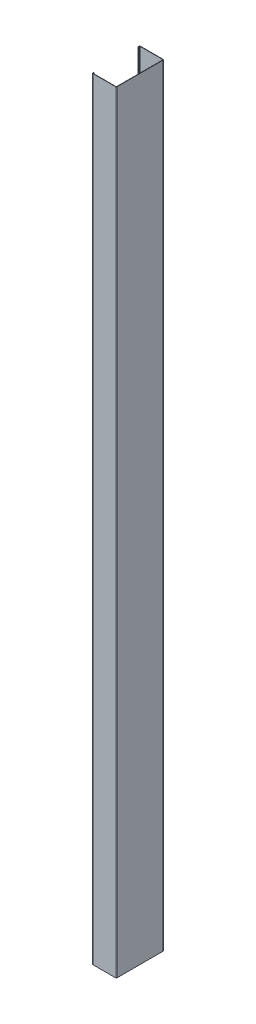
ISO-10303-21;
HEADER;
FILE_DESCRIPTION(('STEP AP214'),'2;1');
FILE_NAME('part.step','',(''),(''),'','','');
FILE_SCHEMA(('AUTOMOTIVE_DESIGN { 1 0 10303 214 1 1 1 1 }'));
ENDSEC;
DATA;
#1=APPLICATION_CONTEXT('core data for automotive mechanical design processes');
#2=APPLICATION_PROTOCOL_DEFINITION('international standard','automotive_design',2000,#1);
#3=PRODUCT_CONTEXT('',#1,'mechanical');
#4=PRODUCT('Part','Part','',(#3));
#5=PRODUCT_RELATED_PRODUCT_CATEGORY('part','',(#4));
#6=PRODUCT_DEFINITION_FORMATION('','',#4);
#7=PRODUCT_DEFINITION_CONTEXT('part definition',#1,'design');
#8=PRODUCT_DEFINITION('design','',#6,#7);
#9=PRODUCT_DEFINITION_SHAPE('','',#8);
#10=(LENGTH_UNIT() NAMED_UNIT(*) SI_UNIT(.MILLI.,.METRE.));
#11=(NAMED_UNIT(*) PLANE_ANGLE_UNIT() SI_UNIT($,.RADIAN.));
#12=(NAMED_UNIT(*) SI_UNIT($,.STERADIAN.) SOLID_ANGLE_UNIT());
#13=UNCERTAINTY_MEASURE_WITH_UNIT(LENGTH_MEASURE(1.E-05),#10,'distance_accuracy_value','');
#14=(GEOMETRIC_REPRESENTATION_CONTEXT(3) GLOBAL_UNCERTAINTY_ASSIGNED_CONTEXT((#13)) GLOBAL_UNIT_ASSIGNED_CONTEXT((#10,
#11,#12)) REPRESENTATION_CONTEXT('',''));
#15=CARTESIAN_POINT('',(0.,0.,0.));
#16=DIRECTION('',(0.,0.,1.));
#17=DIRECTION('',(1.,0.,0.));
#18=AXIS2_PLACEMENT_3D('',#15,#16,#17);
#19=CARTESIAN_POINT('',(-50.,1600.,47.75));
#20=DIRECTION('',(0.,1.,0.));
#21=DIRECTION('',(0.,0.,1.));
#22=AXIS2_PLACEMENT_3D('',#19,#20,#21);
#23=PLANE('',#22);
#24=DIRECTION('',(1.,0.,0.));
#25=VECTOR('',#24,1.);
#26=CARTESIAN_POINT('',(-50.,1600.,47.75));
#27=LINE('',#26,#25);
#28=CARTESIAN_POINT('',(-50.,1600.,47.75));
#29=VERTEX_POINT('',#28);
#30=CARTESIAN_POINT('',(-49.25,1600.,47.75));
#31=VERTEX_POINT('',#30);
#32=EDGE_CURVE('E11',#29,#31,#27,.T.);
#33=ORIENTED_EDGE('',*,*,#32,.F.);
#34=CARTESIAN_POINT('',(-48.5,1600.,47.75));
#35=DIRECTION('',(0.,-1.,0.));
#36=DIRECTION('',(0.,0.,-1.));
#37=AXIS2_PLACEMENT_3D('',#34,#35,#36);
#38=CIRCLE('',#37,1.5);
#39=CARTESIAN_POINT('',(-48.5,1600.,49.25));
#40=VERTEX_POINT('',#39);
#41=EDGE_CURVE('E363',#29,#40,#38,.F.);
#42=ORIENTED_EDGE('',*,*,#41,.T.);
#43=DIRECTION('',(0.,0.,1.));
#44=VECTOR('',#43,1.);
#45=CARTESIAN_POINT('',(-48.5,1600.,48.5));
#46=LINE('',#45,#44);
#47=CARTESIAN_POINT('',(-48.5,1600.,48.5));
#48=VERTEX_POINT('',#47);
#49=EDGE_CURVE('E46',#48,#40,#46,.T.);
#50=ORIENTED_EDGE('',*,*,#49,.F.);
#51=CARTESIAN_POINT('',(-48.5,1600.,47.75));
#52=DIRECTION('',(0.,1.,0.));
#53=DIRECTION('',(1.,0.,0.));
#54=AXIS2_PLACEMENT_3D('',#51,#52,#53);
#55=CIRCLE('',#54,0.75);
#56=EDGE_CURVE('E438',#31,#48,#55,.T.);
#57=ORIENTED_EDGE('',*,*,#56,.F.);
#58=EDGE_LOOP('',(#33,#42,#50,#57));
#59=FACE_BOUND('',#58,.T.);
#60=ADVANCED_FACE('F38',(#59),#23,.T.);
#61=CARTESIAN_POINT('',(-48.5,1600.,48.5));
#62=DIRECTION('',(0.,1.,0.));
#63=DIRECTION('',(0.,0.,1.));
#64=AXIS2_PLACEMENT_3D('',#61,#62,#63);
#65=PLANE('',#64);
#66=DIRECTION('',(0.,0.,1.));
#67=VECTOR('',#66,1.);
#68=CARTESIAN_POINT('',(-50.,1600.,49.25));
#69=LINE('',#68,#67);
#70=CARTESIAN_POINT('',(-50.,1600.,46.25));
#71=VERTEX_POINT('',#70);
#72=EDGE_CURVE('E367',#71,#29,#69,.T.);
#73=ORIENTED_EDGE('',*,*,#72,.T.);
#74=ORIENTED_EDGE('',*,*,#32,.T.);
#75=DIRECTION('',(0.,0.,-1.));
#76=VECTOR('',#75,1.);
#77=CARTESIAN_POINT('',(-49.25,1600.,49.25));
#78=LINE('',#77,#76);
#79=CARTESIAN_POINT('',(-49.25,1600.,46.25));
#80=VERTEX_POINT('',#79);
#81=EDGE_CURVE('E440',#80,#31,#78,.F.);
#82=ORIENTED_EDGE('',*,*,#81,.F.);
#83=DIRECTION('',(1.,0.,0.));
#84=VECTOR('',#83,1.);
#85=CARTESIAN_POINT('',(-50.,1600.,46.25));
#86=LINE('',#85,#84);
#87=EDGE_CURVE('E443',#71,#80,#86,.T.);
#88=ORIENTED_EDGE('',*,*,#87,.F.);
#89=EDGE_LOOP('',(#73,#74,#82,#88));
#90=FACE_BOUND('',#89,.T.);
#91=ADVANCED_FACE('F449',(#90),#65,.T.);
#92=CARTESIAN_POINT('',(-48.5,0.,49.25));
#93=DIRECTION('',(0.,-1.,0.));
#94=DIRECTION('',(0.,0.,-1.));
#95=AXIS2_PLACEMENT_3D('',#92,#93,#94);
#96=PLANE('',#95);
#97=DIRECTION('',(0.,0.,-1.));
#98=VECTOR('',#97,1.);
#99=CARTESIAN_POINT('',(-48.5,0.,49.25));
#100=LINE('',#99,#98);
#101=CARTESIAN_POINT('',(-48.5,0.,49.25));
#102=VERTEX_POINT('',#101);
#103=CARTESIAN_POINT('',(-48.5,0.,48.5));
#104=VERTEX_POINT('',#103);
#105=EDGE_CURVE('E347',#102,#104,#100,.T.);
#106=ORIENTED_EDGE('',*,*,#105,.F.);
#107=CARTESIAN_POINT('',(-48.5,0.,47.75));
#108=DIRECTION('',(0.,-1.,0.));
#109=DIRECTION('',(0.,0.,-1.));
#110=AXIS2_PLACEMENT_3D('',#107,#108,#109);
#111=CIRCLE('',#110,1.5);
#112=CARTESIAN_POINT('',(-50.,0.,47.75));
#113=VERTEX_POINT('',#112);
#114=EDGE_CURVE('E263',#113,#102,#111,.F.);
#115=ORIENTED_EDGE('',*,*,#114,.F.);
#116=DIRECTION('',(-1.,0.,0.));
#117=VECTOR('',#116,1.);
#118=CARTESIAN_POINT('',(-49.25,0.,47.75));
#119=LINE('',#118,#117);
#120=CARTESIAN_POINT('',(-49.25,0.,47.75));
#121=VERTEX_POINT('',#120);
#122=EDGE_CURVE('E345',#121,#113,#119,.T.);
#123=ORIENTED_EDGE('',*,*,#122,.F.);
#124=CARTESIAN_POINT('',(-48.5,0.,47.75));
#125=DIRECTION('',(0.,1.,0.));
#126=DIRECTION('',(1.,0.,0.));
#127=AXIS2_PLACEMENT_3D('',#124,#125,#126);
#128=CIRCLE('',#127,0.75);
#129=EDGE_CURVE('E251',#121,#104,#128,.T.);
#130=ORIENTED_EDGE('',*,*,#129,.T.);
#131=EDGE_LOOP('',(#106,#115,#123,#130));
#132=FACE_BOUND('',#131,.T.);
#133=ADVANCED_FACE('F456',(#132),#96,.T.);
#134=CARTESIAN_POINT('',(-49.25,0.,47.75));
#135=DIRECTION('',(0.,-1.,0.));
#136=DIRECTION('',(0.,0.,-1.));
#137=AXIS2_PLACEMENT_3D('',#134,#135,#136);
#138=PLANE('',#137);
#139=DIRECTION('',(1.,0.,0.));
#140=VECTOR('',#139,1.);
#141=CARTESIAN_POINT('',(0.,0.,49.25));
#142=LINE('',#141,#140);
#143=CARTESIAN_POINT('',(-1.49999999999998,0.,49.25));
#144=VERTEX_POINT('',#143);
#145=EDGE_CURVE('E266',#102,#144,#142,.T.);
#146=ORIENTED_EDGE('',*,*,#145,.F.);
#147=ORIENTED_EDGE('',*,*,#105,.T.);
#148=DIRECTION('',(1.,0.,0.));
#149=VECTOR('',#148,1.);
#150=CARTESIAN_POINT('',(0.,0.,48.5));
#151=LINE('',#150,#149);
#152=CARTESIAN_POINT('',(-1.49999999999998,0.,48.5));
#153=VERTEX_POINT('',#152);
#154=EDGE_CURVE('E248',#104,#153,#151,.T.);
#155=ORIENTED_EDGE('',*,*,#154,.T.);
#156=DIRECTION('',(0.,0.,1.));
#157=VECTOR('',#156,1.);
#158=CARTESIAN_POINT('',(-1.49999999999998,0.,48.5));
#159=LINE('',#158,#157);
#160=EDGE_CURVE('E337',#153,#144,#159,.T.);
#161=ORIENTED_EDGE('',*,*,#160,.T.);
#162=EDGE_LOOP('',(#146,#147,#155,#161));
#163=FACE_BOUND('',#162,.T.);
#164=ADVANCED_FACE('F459',(#163),#138,.T.);
#165=CARTESIAN_POINT('',(-1.49999999999998,1600.,49.25));
#166=DIRECTION('',(0.,1.,0.));
#167=DIRECTION('',(0.,0.,1.));
#168=AXIS2_PLACEMENT_3D('',#165,#166,#167);
#169=PLANE('',#168);
#170=DIRECTION('',(0.,0.,-1.));
#171=VECTOR('',#170,1.);
#172=CARTESIAN_POINT('',(-1.49999999999998,1600.,49.25));
#173=LINE('',#172,#171);
#174=CARTESIAN_POINT('',(-1.49999999999998,1600.,49.25));
#175=VERTEX_POINT('',#174);
#176=CARTESIAN_POINT('',(-1.49999999999998,1600.,48.5));
#177=VERTEX_POINT('',#176);
#178=EDGE_CURVE('E343',#175,#177,#173,.T.);
#179=ORIENTED_EDGE('',*,*,#178,.F.);
#180=CARTESIAN_POINT('',(-1.49999999999998,1600.,47.75));
#181=DIRECTION('',(0.,-1.,0.));
#182=DIRECTION('',(0.,0.,-1.));
#183=AXIS2_PLACEMENT_3D('',#180,#181,#182);
#184=CIRCLE('',#183,1.5);
#185=CARTESIAN_POINT('',(0.,1600.,47.75));
#186=VERTEX_POINT('',#185);
#187=EDGE_CURVE('E375',#175,#186,#184,.F.);
#188=ORIENTED_EDGE('',*,*,#187,.T.);
#189=DIRECTION('',(1.,0.,0.));
#190=VECTOR('',#189,1.);
#191=CARTESIAN_POINT('',(-0.749999999999984,1600.,47.75));
#192=LINE('',#191,#190);
#193=CARTESIAN_POINT('',(-0.749999999999984,1600.,47.75));
#194=VERTEX_POINT('',#193);
#195=EDGE_CURVE('E341',#194,#186,#192,.T.);
#196=ORIENTED_EDGE('',*,*,#195,.F.);
#197=CARTESIAN_POINT('',(-1.49999999999998,1600.,47.75));
#198=DIRECTION('',(0.,1.,0.));
#199=DIRECTION('',(1.,0.,0.));
#200=AXIS2_PLACEMENT_3D('',#197,#198,#199);
#201=CIRCLE('',#200,0.75);
#202=EDGE_CURVE('E434',#177,#194,#201,.T.);
#203=ORIENTED_EDGE('',*,*,#202,.F.);
#204=EDGE_LOOP('',(#179,#188,#196,#203));
#205=FACE_BOUND('',#204,.T.);
#206=ADVANCED_FACE('F479',(#205),#169,.T.);
#207=CARTESIAN_POINT('',(-0.749999999999984,1600.,47.75));
#208=DIRECTION('',(0.,1.,0.));
#209=DIRECTION('',(0.,0.,1.));
#210=AXIS2_PLACEMENT_3D('',#207,#208,#209);
#211=PLANE('',#210);
#212=DIRECTION('',(1.,0.,0.));
#213=VECTOR('',#212,1.);
#214=CARTESIAN_POINT('',(0.,1600.,49.25));
#215=LINE('',#214,#213);
#216=EDGE_CURVE('E354',#40,#175,#215,.T.);
#217=ORIENTED_EDGE('',*,*,#216,.T.);
#218=ORIENTED_EDGE('',*,*,#178,.T.);
#219=DIRECTION('',(1.,0.,0.));
#220=VECTOR('',#219,1.);
#221=CARTESIAN_POINT('',(0.,1600.,48.5));
#222=LINE('',#221,#220);
#223=EDGE_CURVE('E357',#48,#177,#222,.T.);
#224=ORIENTED_EDGE('',*,*,#223,.F.);
#225=ORIENTED_EDGE('',*,*,#49,.T.);
#226=EDGE_LOOP('',(#217,#218,#224,#225));
#227=FACE_BOUND('',#226,.T.);
#228=ADVANCED_FACE('F352',(#227),#211,.T.);
#229=CARTESIAN_POINT('',(0.,0.,47.75));
#230=DIRECTION('',(0.,-1.,0.));
#231=DIRECTION('',(0.,0.,-1.));
#232=AXIS2_PLACEMENT_3D('',#229,#230,#231);
#233=PLANE('',#232);
#234=DIRECTION('',(-1.,0.,0.));
#235=VECTOR('',#234,1.);
#236=CARTESIAN_POINT('',(0.,0.,47.75));
#237=LINE('',#236,#235);
#238=CARTESIAN_POINT('',(0.,0.,47.75));
#239=VERTEX_POINT('',#238);
#240=CARTESIAN_POINT('',(-0.749999999999984,0.,47.75));
#241=VERTEX_POINT('',#240);
#242=EDGE_CURVE('E339',#239,#241,#237,.T.);
#243=ORIENTED_EDGE('',*,*,#242,.F.);
#244=CARTESIAN_POINT('',(-1.49999999999998,0.,47.75));
#245=DIRECTION('',(0.,-1.,0.));
#246=DIRECTION('',(0.,0.,-1.));
#247=AXIS2_PLACEMENT_3D('',#244,#245,#246);
#248=CIRCLE('',#247,1.5);
#249=EDGE_CURVE('E269',#144,#239,#248,.F.);
#250=ORIENTED_EDGE('',*,*,#249,.F.);
#251=ORIENTED_EDGE('',*,*,#160,.F.);
#252=CARTESIAN_POINT('',(-1.49999999999998,0.,47.75));
#253=DIRECTION('',(0.,1.,0.));
#254=DIRECTION('',(1.,0.,0.));
#255=AXIS2_PLACEMENT_3D('',#252,#253,#254);
#256=CIRCLE('',#255,0.75);
#257=EDGE_CURVE('E245',#153,#241,#256,.T.);
#258=ORIENTED_EDGE('',*,*,#257,.T.);
#259=EDGE_LOOP('',(#243,#250,#251,#258));
#260=FACE_BOUND('',#259,.T.);
#261=ADVANCED_FACE('F473',(#260),#233,.T.);
#262=CARTESIAN_POINT('',(-1.49999999999998,0.,48.5));
#263=DIRECTION('',(0.,-1.,0.));
#264=DIRECTION('',(0.,0.,-1.));
#265=AXIS2_PLACEMENT_3D('',#262,#263,#264);
#266=PLANE('',#265);
#267=DIRECTION('',(0.,0.,-1.));
#268=VECTOR('',#267,1.);
#269=CARTESIAN_POINT('',(0.,0.,-49.25));
#270=LINE('',#269,#268);
#271=CARTESIAN_POINT('',(0.,0.,-47.75));
#272=VERTEX_POINT('',#271);
#273=EDGE_CURVE('E272',#239,#272,#270,.T.);
#274=ORIENTED_EDGE('',*,*,#273,.F.);
#275=ORIENTED_EDGE('',*,*,#242,.T.);
#276=DIRECTION('',(0.,0.,-1.));
#277=VECTOR('',#276,1.);
#278=CARTESIAN_POINT('',(-0.750000000000038,0.,-49.25));
#279=LINE('',#278,#277);
#280=CARTESIAN_POINT('',(-0.750000000000037,0.,-47.75));
#281=VERTEX_POINT('',#280);
#282=EDGE_CURVE('E242',#241,#281,#279,.T.);
#283=ORIENTED_EDGE('',*,*,#282,.T.);
#284=DIRECTION('',(1.,0.,0.));
#285=VECTOR('',#284,1.);
#286=CARTESIAN_POINT('',(-0.750000000000037,0.,-47.75));
#287=LINE('',#286,#285);
#288=EDGE_CURVE('E333',#281,#272,#287,.T.);
#289=ORIENTED_EDGE('',*,*,#288,.T.);
#290=EDGE_LOOP('',(#274,#275,#283,#289));
#291=FACE_BOUND('',#290,.T.);
#292=ADVANCED_FACE('F483',(#291),#266,.T.);
#293=CARTESIAN_POINT('',(0.,1600.,-47.75));
#294=DIRECTION('',(0.,1.,0.));
#295=DIRECTION('',(0.,0.,1.));
#296=AXIS2_PLACEMENT_3D('',#293,#294,#295);
#297=PLANE('',#296);
#298=DIRECTION('',(-1.,0.,0.));
#299=VECTOR('',#298,1.);
#300=CARTESIAN_POINT('',(0.,1600.,-47.75));
#301=LINE('',#300,#299);
#302=CARTESIAN_POINT('',(0.,1600.,-47.75));
#303=VERTEX_POINT('',#302);
#304=CARTESIAN_POINT('',(-0.750000000000037,1600.,-47.75));
#305=VERTEX_POINT('',#304);
#306=EDGE_CURVE('E195',#303,#305,#301,.T.);
#307=ORIENTED_EDGE('',*,*,#306,.F.);
#308=CARTESIAN_POINT('',(-1.50000000000004,1600.,-47.75));
#309=DIRECTION('',(0.,-1.,0.));
#310=DIRECTION('',(0.,0.,-1.));
#311=AXIS2_PLACEMENT_3D('',#308,#309,#310);
#312=CIRCLE('',#311,1.5);
#313=CARTESIAN_POINT('',(-1.50000000000004,1600.,-49.25));
#314=VERTEX_POINT('',#313);
#315=EDGE_CURVE('E199',#303,#314,#312,.F.);
#316=ORIENTED_EDGE('',*,*,#315,.T.);
#317=DIRECTION('',(0.,0.,-1.));
#318=VECTOR('',#317,1.);
#319=CARTESIAN_POINT('',(-1.50000000000004,1600.,-48.5));
#320=LINE('',#319,#318);
#321=CARTESIAN_POINT('',(-1.50000000000004,1600.,-48.5));
#322=VERTEX_POINT('',#321);
#323=EDGE_CURVE('E183',#322,#314,#320,.T.);
#324=ORIENTED_EDGE('',*,*,#323,.F.);
#325=CARTESIAN_POINT('',(-1.50000000000004,1600.,-47.75));
#326=DIRECTION('',(0.,1.,0.));
#327=DIRECTION('',(1.,0.,0.));
#328=AXIS2_PLACEMENT_3D('',#325,#326,#327);
#329=CIRCLE('',#328,0.75);
#330=EDGE_CURVE('E396',#305,#322,#329,.T.);
#331=ORIENTED_EDGE('',*,*,#330,.F.);
#332=EDGE_LOOP('',(#307,#316,#324,#331));
#333=FACE_BOUND('',#332,.T.);
#334=ADVANCED_FACE('F201',(#333),#297,.T.);
#335=CARTESIAN_POINT('',(-1.50000000000004,1600.,-48.5));
#336=DIRECTION('',(0.,1.,0.));
#337=DIRECTION('',(0.,0.,1.));
#338=AXIS2_PLACEMENT_3D('',#335,#336,#337);
#339=PLANE('',#338);
#340=DIRECTION('',(0.,0.,-1.));
#341=VECTOR('',#340,1.);
#342=CARTESIAN_POINT('',(0.,1600.,-49.25));
#343=LINE('',#342,#341);
#344=EDGE_CURVE('E205',#186,#303,#343,.T.);
#345=ORIENTED_EDGE('',*,*,#344,.T.);
#346=ORIENTED_EDGE('',*,*,#306,.T.);
#347=DIRECTION('',(0.,0.,-1.));
#348=VECTOR('',#347,1.);
#349=CARTESIAN_POINT('',(-0.750000000000038,1600.,-49.25));
#350=LINE('',#349,#348);
#351=EDGE_CURVE('E431',#194,#305,#350,.T.);
#352=ORIENTED_EDGE('',*,*,#351,.F.);
#353=ORIENTED_EDGE('',*,*,#195,.T.);
#354=EDGE_LOOP('',(#345,#346,#352,#353));
#355=FACE_BOUND('',#354,.T.);
#356=ADVANCED_FACE('F383',(#355),#339,.T.);
#357=CARTESIAN_POINT('',(-1.50000000000004,0.,-49.25));
#358=DIRECTION('',(0.,-1.,0.));
#359=DIRECTION('',(0.,0.,-1.));
#360=AXIS2_PLACEMENT_3D('',#357,#358,#359);
#361=PLANE('',#360);
#362=DIRECTION('',(0.,0.,1.));
#363=VECTOR('',#362,1.);
#364=CARTESIAN_POINT('',(-1.50000000000004,0.,-49.25));
#365=LINE('',#364,#363);
#366=CARTESIAN_POINT('',(-1.50000000000004,0.,-49.25));
#367=VERTEX_POINT('',#366);
#368=CARTESIAN_POINT('',(-1.50000000000004,0.,-48.5));
#369=VERTEX_POINT('',#368);
#370=EDGE_CURVE('E196',#367,#369,#365,.T.);
#371=ORIENTED_EDGE('',*,*,#370,.F.);
#372=CARTESIAN_POINT('',(-1.50000000000004,0.,-47.75));
#373=DIRECTION('',(0.,-1.,0.));
#374=DIRECTION('',(0.,0.,-1.));
#375=AXIS2_PLACEMENT_3D('',#372,#373,#374);
#376=CIRCLE('',#375,1.5);
#377=EDGE_CURVE('E212',#272,#367,#376,.F.);
#378=ORIENTED_EDGE('',*,*,#377,.F.);
#379=ORIENTED_EDGE('',*,*,#288,.F.);
#380=CARTESIAN_POINT('',(-1.50000000000004,0.,-47.75));
#381=DIRECTION('',(0.,1.,0.));
#382=DIRECTION('',(1.,0.,0.));
#383=AXIS2_PLACEMENT_3D('',#380,#381,#382);
#384=CIRCLE('',#383,0.75);
#385=EDGE_CURVE('E239',#281,#369,#384,.T.);
#386=ORIENTED_EDGE('',*,*,#385,.T.);
#387=EDGE_LOOP('',(#371,#378,#379,#386));
#388=FACE_BOUND('',#387,.T.);
#389=ADVANCED_FACE('F390',(#388),#361,.T.);
#390=CARTESIAN_POINT('',(-0.750000000000037,0.,-47.75));
#391=DIRECTION('',(0.,-1.,0.));
#392=DIRECTION('',(0.,0.,-1.));
#393=AXIS2_PLACEMENT_3D('',#390,#391,#392);
#394=PLANE('',#393);
#395=DIRECTION('',(-1.,0.,0.));
#396=VECTOR('',#395,1.);
#397=CARTESIAN_POINT('',(-50.,0.,-49.25));
#398=LINE('',#397,#396);
#399=CARTESIAN_POINT('',(-48.5,0.,-49.25));
#400=VERTEX_POINT('',#399);
#401=EDGE_CURVE('E276',#367,#400,#398,.T.);
#402=ORIENTED_EDGE('',*,*,#401,.F.);
#403=ORIENTED_EDGE('',*,*,#370,.T.);
#404=DIRECTION('',(1.,0.,0.));
#405=VECTOR('',#404,1.);
#406=CARTESIAN_POINT('',(-50.,0.,-48.5));
#407=LINE('',#406,#405);
#408=CARTESIAN_POINT('',(-48.5,0.,-48.5));
#409=VERTEX_POINT('',#408);
#410=EDGE_CURVE('E237',#369,#409,#407,.F.);
#411=ORIENTED_EDGE('',*,*,#410,.T.);
#412=DIRECTION('',(0.,0.,-1.));
#413=VECTOR('',#412,1.);
#414=CARTESIAN_POINT('',(-48.5,0.,-48.5));
#415=LINE('',#414,#413);
#416=EDGE_CURVE('E119',#409,#400,#415,.T.);
#417=ORIENTED_EDGE('',*,*,#416,.T.);
#418=EDGE_LOOP('',(#402,#403,#411,#417));
#419=FACE_BOUND('',#418,.T.);
#420=ADVANCED_FACE('F392',(#419),#394,.T.);
#421=CARTESIAN_POINT('',(-48.5,1600.,-49.25));
#422=DIRECTION('',(0.,1.,0.));
#423=DIRECTION('',(0.,0.,1.));
#424=AXIS2_PLACEMENT_3D('',#421,#422,#423);
#425=PLANE('',#424);
#426=DIRECTION('',(0.,0.,1.));
#427=VECTOR('',#426,1.);
#428=CARTESIAN_POINT('',(-48.5,1600.,-49.25));
#429=LINE('',#428,#427);
#430=CARTESIAN_POINT('',(-48.5,1600.,-49.25));
#431=VERTEX_POINT('',#430);
#432=CARTESIAN_POINT('',(-48.5,1600.,-48.5));
#433=VERTEX_POINT('',#432);
#434=EDGE_CURVE('E331',#431,#433,#429,.T.);
#435=ORIENTED_EDGE('',*,*,#434,.F.);
#436=CARTESIAN_POINT('',(-48.5,1600.,-47.75));
#437=DIRECTION('',(0.,-1.,0.));
#438=DIRECTION('',(0.,0.,-1.));
#439=AXIS2_PLACEMENT_3D('',#436,#437,#438);
#440=CIRCLE('',#439,1.5);
#441=CARTESIAN_POINT('',(-50.,1600.,-47.75));
#442=VERTEX_POINT('',#441);
#443=EDGE_CURVE('E220',#431,#442,#440,.F.);
#444=ORIENTED_EDGE('',*,*,#443,.T.);
#445=DIRECTION('',(-1.,0.,0.));
#446=VECTOR('',#445,1.);
#447=CARTESIAN_POINT('',(-49.25,1600.,-47.75));
#448=LINE('',#447,#446);
#449=CARTESIAN_POINT('',(-49.25,1600.,-47.75));
#450=VERTEX_POINT('',#449);
#451=EDGE_CURVE('E54',#450,#442,#448,.T.);
#452=ORIENTED_EDGE('',*,*,#451,.F.);
#453=CARTESIAN_POINT('',(-48.5,1600.,-47.75));
#454=DIRECTION('',(0.,1.,0.));
#455=DIRECTION('',(1.,0.,0.));
#456=AXIS2_PLACEMENT_3D('',#453,#454,#455);
#457=CIRCLE('',#456,0.75);
#458=EDGE_CURVE('E424',#433,#450,#457,.T.);
#459=ORIENTED_EDGE('',*,*,#458,.F.);
#460=EDGE_LOOP('',(#435,#444,#452,#459));
#461=FACE_BOUND('',#460,.T.);
#462=ADVANCED_FACE('F554',(#461),#425,.T.);
#463=CARTESIAN_POINT('',(-49.25,1600.,-47.75));
#464=DIRECTION('',(0.,1.,0.));
#465=DIRECTION('',(0.,0.,1.));
#466=AXIS2_PLACEMENT_3D('',#463,#464,#465);
#467=PLANE('',#466);
#468=DIRECTION('',(-1.,0.,0.));
#469=VECTOR('',#468,1.);
#470=CARTESIAN_POINT('',(-50.,1600.,-49.25));
#471=LINE('',#470,#469);
#472=EDGE_CURVE('E187',#314,#431,#471,.T.);
#473=ORIENTED_EDGE('',*,*,#472,.T.);
#474=ORIENTED_EDGE('',*,*,#434,.T.);
#475=DIRECTION('',(1.,0.,0.));
#476=VECTOR('',#475,1.);
#477=CARTESIAN_POINT('',(-50.,1600.,-48.5));
#478=LINE('',#477,#476);
#479=EDGE_CURVE('E190',#322,#433,#478,.F.);
#480=ORIENTED_EDGE('',*,*,#479,.F.);
#481=ORIENTED_EDGE('',*,*,#323,.T.);
#482=EDGE_LOOP('',(#473,#474,#480,#481));
#483=FACE_BOUND('',#482,.T.);
#484=ADVANCED_FACE('F185',(#483),#467,.T.);
#485=CARTESIAN_POINT('',(-50.,0.,-47.75));
#486=DIRECTION('',(0.,-1.,0.));
#487=DIRECTION('',(0.,0.,-1.));
#488=AXIS2_PLACEMENT_3D('',#485,#486,#487);
#489=PLANE('',#488);
#490=DIRECTION('',(1.,0.,0.));
#491=VECTOR('',#490,1.);
#492=CARTESIAN_POINT('',(-50.,0.,-47.75));
#493=LINE('',#492,#491);
#494=CARTESIAN_POINT('',(-50.,0.,-47.75));
#495=VERTEX_POINT('',#494);
#496=CARTESIAN_POINT('',(-49.25,0.,-47.75));
#497=VERTEX_POINT('',#496);
#498=EDGE_CURVE('E126',#495,#497,#493,.T.);
#499=ORIENTED_EDGE('',*,*,#498,.F.);
#500=CARTESIAN_POINT('',(-48.5,0.,-47.75));
#501=DIRECTION('',(0.,-1.,0.));
#502=DIRECTION('',(0.,0.,-1.));
#503=AXIS2_PLACEMENT_3D('',#500,#501,#502);
#504=CIRCLE('',#503,1.5);
#505=EDGE_CURVE('E278',#400,#495,#504,.F.);
#506=ORIENTED_EDGE('',*,*,#505,.F.);
#507=ORIENTED_EDGE('',*,*,#416,.F.);
#508=CARTESIAN_POINT('',(-48.5,0.,-47.75));
#509=DIRECTION('',(0.,1.,0.));
#510=DIRECTION('',(1.,0.,0.));
#511=AXIS2_PLACEMENT_3D('',#508,#509,#510);
#512=CIRCLE('',#511,0.75);
#513=EDGE_CURVE('E235',#409,#497,#512,.T.);
#514=ORIENTED_EDGE('',*,*,#513,.T.);
#515=EDGE_LOOP('',(#499,#506,#507,#514));
#516=FACE_BOUND('',#515,.T.);
#517=ADVANCED_FACE('F407',(#516),#489,.T.);
#518=CARTESIAN_POINT('',(-48.5,0.,-48.5));
#519=DIRECTION('',(0.,-1.,0.));
#520=DIRECTION('',(0.,0.,-1.));
#521=AXIS2_PLACEMENT_3D('',#518,#519,#520);
#522=PLANE('',#521);
#523=DIRECTION('',(0.,0.,1.));
#524=VECTOR('',#523,1.);
#525=CARTESIAN_POINT('',(-50.,0.,-49.25));
#526=LINE('',#525,#524);
#527=CARTESIAN_POINT('',(-50.,0.,-46.25));
#528=VERTEX_POINT('',#527);
#529=EDGE_CURVE('E226',#495,#528,#526,.T.);
#530=ORIENTED_EDGE('',*,*,#529,.F.);
#531=ORIENTED_EDGE('',*,*,#498,.T.);
#532=DIRECTION('',(0.,0.,-1.));
#533=VECTOR('',#532,1.);
#534=CARTESIAN_POINT('',(-49.25,0.,-49.25));
#535=LINE('',#534,#533);
#536=CARTESIAN_POINT('',(-49.25,0.,-46.25));
#537=VERTEX_POINT('',#536);
#538=EDGE_CURVE('E232',#497,#537,#535,.F.);
#539=ORIENTED_EDGE('',*,*,#538,.T.);
#540=DIRECTION('',(-1.,0.,0.));
#541=VECTOR('',#540,1.);
#542=CARTESIAN_POINT('',(-49.25,0.,-46.25));
#543=LINE('',#542,#541);
#544=EDGE_CURVE('E229',#537,#528,#543,.T.);
#545=ORIENTED_EDGE('',*,*,#544,.T.);
#546=EDGE_LOOP('',(#530,#531,#539,#545));
#547=FACE_BOUND('',#546,.T.);
#548=ADVANCED_FACE('F415',(#547),#522,.T.);
#549=CARTESIAN_POINT('',(-50.,1600.,-49.25));
#550=DIRECTION('',(1.,0.,0.));
#551=DIRECTION('',(0.,0.,-1.));
#552=AXIS2_PLACEMENT_3D('',#549,#550,#551);
#553=PLANE('',#552);
#554=ORIENTED_EDGE('',*,*,#529,.T.);
#555=DIRECTION('',(0.,-1.,0.));
#556=VECTOR('',#555,1.);
#557=CARTESIAN_POINT('',(-50.,1600.,-46.25));
#558=LINE('',#557,#556);
#559=CARTESIAN_POINT('',(-50.,1600.,-46.25));
#560=VERTEX_POINT('',#559);
#561=EDGE_CURVE('E326',#560,#528,#558,.T.);
#562=ORIENTED_EDGE('',*,*,#561,.F.);
#563=DIRECTION('',(0.,0.,1.));
#564=VECTOR('',#563,1.);
#565=CARTESIAN_POINT('',(-50.,1600.,-49.25));
#566=LINE('',#565,#564);
#567=EDGE_CURVE('E132',#442,#560,#566,.T.);
#568=ORIENTED_EDGE('',*,*,#567,.F.);
#569=DIRECTION('',(0.,-1.,0.));
#570=VECTOR('',#569,1.);
#571=CARTESIAN_POINT('',(-50.,1600.,-47.75));
#572=LINE('',#571,#570);
#573=EDGE_CURVE('E222',#442,#495,#572,.T.);
#574=ORIENTED_EDGE('',*,*,#573,.T.);
#575=EDGE_LOOP('',(#554,#562,#568,#574));
#576=FACE_BOUND('',#575,.T.);
#577=ADVANCED_FACE('F413',(#576),#553,.F.);
#578=CARTESIAN_POINT('',(-49.25,1600.,-46.25));
#579=DIRECTION('',(0.,0.,1.));
#580=DIRECTION('',(1.,0.,0.));
#581=AXIS2_PLACEMENT_3D('',#578,#579,#580);
#582=PLANE('',#581);
#583=ORIENTED_EDGE('',*,*,#544,.F.);
#584=DIRECTION('',(0.,-1.,0.));
#585=VECTOR('',#584,1.);
#586=CARTESIAN_POINT('',(-49.25,1600.,-46.25));
#587=LINE('',#586,#585);
#588=CARTESIAN_POINT('',(-49.25,1600.,-46.25));
#589=VERTEX_POINT('',#588);
#590=EDGE_CURVE('E324',#589,#537,#587,.T.);
#591=ORIENTED_EDGE('',*,*,#590,.F.);
#592=DIRECTION('',(-1.,0.,0.));
#593=VECTOR('',#592,1.);
#594=CARTESIAN_POINT('',(-49.25,1600.,-46.25));
#595=LINE('',#594,#593);
#596=EDGE_CURVE('E420',#589,#560,#595,.T.);
#597=ORIENTED_EDGE('',*,*,#596,.T.);
#598=ORIENTED_EDGE('',*,*,#561,.T.);
#599=EDGE_LOOP('',(#583,#591,#597,#598));
#600=FACE_BOUND('',#599,.T.);
#601=ADVANCED_FACE('F418',(#600),#582,.T.);
#602=CARTESIAN_POINT('',(-49.25,1600.,-49.25));
#603=DIRECTION('',(1.,0.,0.));
#604=DIRECTION('',(0.,0.,-1.));
#605=AXIS2_PLACEMENT_3D('',#602,#603,#604);
#606=PLANE('',#605);
#607=ORIENTED_EDGE('',*,*,#538,.F.);
#608=DIRECTION('',(0.,-1.,0.));
#609=VECTOR('',#608,1.);
#610=CARTESIAN_POINT('',(-49.25,1600.,-47.75));
#611=LINE('',#610,#609);
#612=EDGE_CURVE('E321',#450,#497,#611,.T.);
#613=ORIENTED_EDGE('',*,*,#612,.F.);
#614=DIRECTION('',(0.,0.,-1.));
#615=VECTOR('',#614,1.);
#616=CARTESIAN_POINT('',(-49.25,1600.,-49.25));
#617=LINE('',#616,#615);
#618=EDGE_CURVE('E422',#450,#589,#617,.F.);
#619=ORIENTED_EDGE('',*,*,#618,.T.);
#620=ORIENTED_EDGE('',*,*,#590,.T.);
#621=EDGE_LOOP('',(#607,#613,#619,#620));
#622=FACE_BOUND('',#621,.T.);
#623=ADVANCED_FACE('F610',(#622),#606,.T.);
#624=CARTESIAN_POINT('',(-48.5,1600.,-47.75));
#625=DIRECTION('',(0.,-1.,0.));
#626=DIRECTION('',(0.,0.,-1.));
#627=AXIS2_PLACEMENT_3D('',#624,#625,#626);
#628=CYLINDRICAL_SURFACE('',#627,0.75);
#629=ORIENTED_EDGE('',*,*,#513,.F.);
#630=DIRECTION('',(0.,-1.,0.));
#631=VECTOR('',#630,1.);
#632=CARTESIAN_POINT('',(-48.5,1600.,-48.5));
#633=LINE('',#632,#631);
#634=EDGE_CURVE('E318',#433,#409,#633,.T.);
#635=ORIENTED_EDGE('',*,*,#634,.F.);
#636=ORIENTED_EDGE('',*,*,#458,.T.);
#637=ORIENTED_EDGE('',*,*,#612,.T.);
#638=EDGE_LOOP('',(#629,#635,#636,#637));
#639=FACE_BOUND('',#638,.T.);
#640=ADVANCED_FACE('F404',(#639),#628,.F.);
#641=CARTESIAN_POINT('',(-50.,1600.,-48.5));
#642=DIRECTION('',(0.,0.,1.));
#643=DIRECTION('',(1.,0.,0.));
#644=AXIS2_PLACEMENT_3D('',#641,#642,#643);
#645=PLANE('',#644);
#646=ORIENTED_EDGE('',*,*,#410,.F.);
#647=DIRECTION('',(0.,-1.,0.));
#648=VECTOR('',#647,1.);
#649=CARTESIAN_POINT('',(-1.50000000000004,1600.,-48.5));
#650=LINE('',#649,#648);
#651=EDGE_CURVE('E315',#322,#369,#650,.T.);
#652=ORIENTED_EDGE('',*,*,#651,.F.);
#653=ORIENTED_EDGE('',*,*,#479,.T.);
#654=ORIENTED_EDGE('',*,*,#634,.T.);
#655=EDGE_LOOP('',(#646,#652,#653,#654));
#656=FACE_BOUND('',#655,.T.);
#657=ADVANCED_FACE('F398',(#656),#645,.T.);
#658=CARTESIAN_POINT('',(-1.50000000000004,1600.,-47.75));
#659=DIRECTION('',(0.,-1.,0.));
#660=DIRECTION('',(0.,0.,-1.));
#661=AXIS2_PLACEMENT_3D('',#658,#659,#660);
#662=CYLINDRICAL_SURFACE('',#661,0.75);
#663=ORIENTED_EDGE('',*,*,#385,.F.);
#664=DIRECTION('',(0.,-1.,0.));
#665=VECTOR('',#664,1.);
#666=CARTESIAN_POINT('',(-0.750000000000037,1600.,-47.75));
#667=LINE('',#666,#665);
#668=EDGE_CURVE('E312',#305,#281,#667,.T.);
#669=ORIENTED_EDGE('',*,*,#668,.F.);
#670=ORIENTED_EDGE('',*,*,#330,.T.);
#671=ORIENTED_EDGE('',*,*,#651,.T.);
#672=EDGE_LOOP('',(#663,#669,#670,#671));
#673=FACE_BOUND('',#672,.T.);
#674=ADVANCED_FACE('F395',(#673),#662,.F.);
#675=CARTESIAN_POINT('',(-0.750000000000038,1600.,-49.25));
#676=DIRECTION('',(-1.,0.,0.));
#677=DIRECTION('',(0.,0.,1.));
#678=AXIS2_PLACEMENT_3D('',#675,#676,#677);
#679=PLANE('',#678);
#680=ORIENTED_EDGE('',*,*,#282,.F.);
#681=DIRECTION('',(0.,-1.,0.));
#682=VECTOR('',#681,1.);
#683=CARTESIAN_POINT('',(-0.749999999999984,1600.,47.75));
#684=LINE('',#683,#682);
#685=EDGE_CURVE('E309',#194,#241,#684,.T.);
#686=ORIENTED_EDGE('',*,*,#685,.F.);
#687=ORIENTED_EDGE('',*,*,#351,.T.);
#688=ORIENTED_EDGE('',*,*,#668,.T.);
#689=EDGE_LOOP('',(#680,#686,#687,#688));
#690=FACE_BOUND('',#689,.T.);
#691=ADVANCED_FACE('F481',(#690),#679,.T.);
#692=CARTESIAN_POINT('',(-1.49999999999998,1600.,47.75));
#693=DIRECTION('',(0.,-1.,0.));
#694=DIRECTION('',(0.,0.,-1.));
#695=AXIS2_PLACEMENT_3D('',#692,#693,#694);
#696=CYLINDRICAL_SURFACE('',#695,0.75);
#697=ORIENTED_EDGE('',*,*,#257,.F.);
#698=DIRECTION('',(0.,-1.,0.));
#699=VECTOR('',#698,1.);
#700=CARTESIAN_POINT('',(-1.49999999999998,1600.,48.5));
#701=LINE('',#700,#699);
#702=EDGE_CURVE('E306',#177,#153,#701,.T.);
#703=ORIENTED_EDGE('',*,*,#702,.F.);
#704=ORIENTED_EDGE('',*,*,#202,.T.);
#705=ORIENTED_EDGE('',*,*,#685,.T.);
#706=EDGE_LOOP('',(#697,#703,#704,#705));
#707=FACE_BOUND('',#706,.T.);
#708=ADVANCED_FACE('F469',(#707),#696,.F.);
#709=CARTESIAN_POINT('',(0.,1600.,48.5));
#710=DIRECTION('',(0.,0.,-1.));
#711=DIRECTION('',(-1.,0.,0.));
#712=AXIS2_PLACEMENT_3D('',#709,#710,#711);
#713=PLANE('',#712);
#714=ORIENTED_EDGE('',*,*,#154,.F.);
#715=DIRECTION('',(0.,-1.,0.));
#716=VECTOR('',#715,1.);
#717=CARTESIAN_POINT('',(-48.5,1600.,48.5));
#718=LINE('',#717,#716);
#719=EDGE_CURVE('E303',#48,#104,#718,.T.);
#720=ORIENTED_EDGE('',*,*,#719,.F.);
#721=ORIENTED_EDGE('',*,*,#223,.T.);
#722=ORIENTED_EDGE('',*,*,#702,.T.);
#723=EDGE_LOOP('',(#714,#720,#721,#722));
#724=FACE_BOUND('',#723,.T.);
#725=ADVANCED_FACE('F464',(#724),#713,.T.);
#726=CARTESIAN_POINT('',(-48.5,1600.,47.75));
#727=DIRECTION('',(0.,-1.,0.));
#728=DIRECTION('',(0.,0.,-1.));
#729=AXIS2_PLACEMENT_3D('',#726,#727,#728);
#730=CYLINDRICAL_SURFACE('',#729,0.75);
#731=ORIENTED_EDGE('',*,*,#129,.F.);
#732=DIRECTION('',(0.,-1.,0.));
#733=VECTOR('',#732,1.);
#734=CARTESIAN_POINT('',(-49.25,1600.,47.75));
#735=LINE('',#734,#733);
#736=EDGE_CURVE('E300',#31,#121,#735,.T.);
#737=ORIENTED_EDGE('',*,*,#736,.F.);
#738=ORIENTED_EDGE('',*,*,#56,.T.);
#739=ORIENTED_EDGE('',*,*,#719,.T.);
#740=EDGE_LOOP('',(#731,#737,#738,#739));
#741=FACE_BOUND('',#740,.T.);
#742=ADVANCED_FACE('F462',(#741),#730,.F.);
#743=CARTESIAN_POINT('',(-49.25,1600.,49.25));
#744=DIRECTION('',(1.,0.,0.));
#745=DIRECTION('',(0.,0.,-1.));
#746=AXIS2_PLACEMENT_3D('',#743,#744,#745);
#747=PLANE('',#746);
#748=DIRECTION('',(0.,0.,-1.));
#749=VECTOR('',#748,1.);
#750=CARTESIAN_POINT('',(-49.25,0.,49.25));
#751=LINE('',#750,#749);
#752=CARTESIAN_POINT('',(-49.25,0.,46.25));
#753=VERTEX_POINT('',#752);
#754=EDGE_CURVE('E254',#753,#121,#751,.F.);
#755=ORIENTED_EDGE('',*,*,#754,.F.);
#756=DIRECTION('',(0.,-1.,0.));
#757=VECTOR('',#756,1.);
#758=CARTESIAN_POINT('',(-49.25,1600.,46.25));
#759=LINE('',#758,#757);
#760=EDGE_CURVE('E298',#80,#753,#759,.T.);
#761=ORIENTED_EDGE('',*,*,#760,.F.);
#762=ORIENTED_EDGE('',*,*,#81,.T.);
#763=ORIENTED_EDGE('',*,*,#736,.T.);
#764=EDGE_LOOP('',(#755,#761,#762,#763));
#765=FACE_BOUND('',#764,.T.);
#766=ADVANCED_FACE('F684',(#765),#747,.T.);
#767=CARTESIAN_POINT('',(-50.,1600.,46.25));
#768=DIRECTION('',(0.,0.,-1.));
#769=DIRECTION('',(-1.,0.,0.));
#770=AXIS2_PLACEMENT_3D('',#767,#768,#769);
#771=PLANE('',#770);
#772=DIRECTION('',(1.,0.,0.));
#773=VECTOR('',#772,1.);
#774=CARTESIAN_POINT('',(-50.,0.,46.25));
#775=LINE('',#774,#773);
#776=CARTESIAN_POINT('',(-50.,0.,46.25));
#777=VERTEX_POINT('',#776);
#778=EDGE_CURVE('E257',#777,#753,#775,.T.);
#779=ORIENTED_EDGE('',*,*,#778,.F.);
#780=DIRECTION('',(0.,-1.,0.));
#781=VECTOR('',#780,1.);
#782=CARTESIAN_POINT('',(-50.,1600.,46.25));
#783=LINE('',#782,#781);
#784=EDGE_CURVE('E296',#71,#777,#783,.T.);
#785=ORIENTED_EDGE('',*,*,#784,.F.);
#786=ORIENTED_EDGE('',*,*,#87,.T.);
#787=ORIENTED_EDGE('',*,*,#760,.T.);
#788=EDGE_LOOP('',(#779,#785,#786,#787));
#789=FACE_BOUND('',#788,.T.);
#790=ADVANCED_FACE('F694',(#789),#771,.T.);
#791=CARTESIAN_POINT('',(-50.,1600.,49.25));
#792=DIRECTION('',(1.,0.,0.));
#793=DIRECTION('',(0.,0.,-1.));
#794=AXIS2_PLACEMENT_3D('',#791,#792,#793);
#795=PLANE('',#794);
#796=DIRECTION('',(0.,0.,1.));
#797=VECTOR('',#796,1.);
#798=CARTESIAN_POINT('',(-50.,0.,49.25));
#799=LINE('',#798,#797);
#800=EDGE_CURVE('E260',#777,#113,#799,.T.);
#801=ORIENTED_EDGE('',*,*,#800,.T.);
#802=DIRECTION('',(0.,-1.,0.));
#803=VECTOR('',#802,1.);
#804=CARTESIAN_POINT('',(-50.,1600.,47.75));
#805=LINE('',#804,#803);
#806=EDGE_CURVE('E293',#29,#113,#805,.T.);
#807=ORIENTED_EDGE('',*,*,#806,.F.);
#808=ORIENTED_EDGE('',*,*,#72,.F.);
#809=ORIENTED_EDGE('',*,*,#784,.T.);
#810=EDGE_LOOP('',(#801,#807,#808,#809));
#811=FACE_BOUND('',#810,.T.);
#812=ADVANCED_FACE('F453',(#811),#795,.F.);
#813=CARTESIAN_POINT('',(-48.5,1600.,47.75));
#814=DIRECTION('',(0.,-1.,0.));
#815=DIRECTION('',(0.,0.,-1.));
#816=AXIS2_PLACEMENT_3D('',#813,#814,#815);
#817=CYLINDRICAL_SURFACE('',#816,1.5);
#818=ORIENTED_EDGE('',*,*,#114,.T.);
#819=DIRECTION('',(0.,-1.,0.));
#820=VECTOR('',#819,1.);
#821=CARTESIAN_POINT('',(-48.5,1600.,49.25));
#822=LINE('',#821,#820);
#823=EDGE_CURVE('E290',#40,#102,#822,.T.);
#824=ORIENTED_EDGE('',*,*,#823,.F.);
#825=ORIENTED_EDGE('',*,*,#41,.F.);
#826=ORIENTED_EDGE('',*,*,#806,.T.);
#827=EDGE_LOOP('',(#818,#824,#825,#826));
#828=FACE_BOUND('',#827,.T.);
#829=ADVANCED_FACE('F369',(#828),#817,.T.);
#830=CARTESIAN_POINT('',(0.,1600.,49.25));
#831=DIRECTION('',(0.,0.,-1.));
#832=DIRECTION('',(-1.,0.,0.));
#833=AXIS2_PLACEMENT_3D('',#830,#831,#832);
#834=PLANE('',#833);
#835=ORIENTED_EDGE('',*,*,#145,.T.);
#836=DIRECTION('',(0.,-1.,0.));
#837=VECTOR('',#836,1.);
#838=CARTESIAN_POINT('',(-1.49999999999998,1600.,49.25));
#839=LINE('',#838,#837);
#840=EDGE_CURVE('E287',#175,#144,#839,.T.);
#841=ORIENTED_EDGE('',*,*,#840,.F.);
#842=ORIENTED_EDGE('',*,*,#216,.F.);
#843=ORIENTED_EDGE('',*,*,#823,.T.);
#844=EDGE_LOOP('',(#835,#841,#842,#843));
#845=FACE_BOUND('',#844,.T.);
#846=ADVANCED_FACE('F373',(#845),#834,.F.);
#847=CARTESIAN_POINT('',(-1.49999999999998,1600.,47.75));
#848=DIRECTION('',(0.,-1.,0.));
#849=DIRECTION('',(0.,0.,-1.));
#850=AXIS2_PLACEMENT_3D('',#847,#848,#849);
#851=CYLINDRICAL_SURFACE('',#850,1.5);
#852=ORIENTED_EDGE('',*,*,#249,.T.);
#853=DIRECTION('',(0.,-1.,0.));
#854=VECTOR('',#853,1.);
#855=CARTESIAN_POINT('',(0.,1600.,47.75));
#856=LINE('',#855,#854);
#857=EDGE_CURVE('E284',#186,#239,#856,.T.);
#858=ORIENTED_EDGE('',*,*,#857,.F.);
#859=ORIENTED_EDGE('',*,*,#187,.F.);
#860=ORIENTED_EDGE('',*,*,#840,.T.);
#861=EDGE_LOOP('',(#852,#858,#859,#860));
#862=FACE_BOUND('',#861,.T.);
#863=ADVANCED_FACE('F476',(#862),#851,.T.);
#864=CARTESIAN_POINT('',(0.,1600.,-49.25));
#865=DIRECTION('',(-1.,0.,0.));
#866=DIRECTION('',(0.,0.,1.));
#867=AXIS2_PLACEMENT_3D('',#864,#865,#866);
#868=PLANE('',#867);
#869=ORIENTED_EDGE('',*,*,#273,.T.);
#870=DIRECTION('',(0.,-1.,0.));
#871=VECTOR('',#870,1.);
#872=CARTESIAN_POINT('',(0.,1600.,-47.75));
#873=LINE('',#872,#871);
#874=EDGE_CURVE('E214',#303,#272,#873,.T.);
#875=ORIENTED_EDGE('',*,*,#874,.F.);
#876=ORIENTED_EDGE('',*,*,#344,.F.);
#877=ORIENTED_EDGE('',*,*,#857,.T.);
#878=EDGE_LOOP('',(#869,#875,#876,#877));
#879=FACE_BOUND('',#878,.T.);
#880=ADVANCED_FACE('F387',(#879),#868,.F.);
#881=CARTESIAN_POINT('',(-1.50000000000004,1600.,-47.75));
#882=DIRECTION('',(0.,-1.,0.));
#883=DIRECTION('',(0.,0.,-1.));
#884=AXIS2_PLACEMENT_3D('',#881,#882,#883);
#885=CYLINDRICAL_SURFACE('',#884,1.5);
#886=ORIENTED_EDGE('',*,*,#377,.T.);
#887=DIRECTION('',(0.,-1.,0.));
#888=VECTOR('',#887,1.);
#889=CARTESIAN_POINT('',(-1.50000000000004,1600.,-49.25));
#890=LINE('',#889,#888);
#891=EDGE_CURVE('E209',#314,#367,#890,.T.);
#892=ORIENTED_EDGE('',*,*,#891,.F.);
#893=ORIENTED_EDGE('',*,*,#315,.F.);
#894=ORIENTED_EDGE('',*,*,#874,.T.);
#895=EDGE_LOOP('',(#886,#892,#893,#894));
#896=FACE_BOUND('',#895,.T.);
#897=ADVANCED_FACE('F210',(#896),#885,.T.);
#898=CARTESIAN_POINT('',(-50.,1600.,-49.25));
#899=DIRECTION('',(0.,0.,1.));
#900=DIRECTION('',(1.,0.,0.));
#901=AXIS2_PLACEMENT_3D('',#898,#899,#900);
#902=PLANE('',#901);
#903=ORIENTED_EDGE('',*,*,#401,.T.);
#904=DIRECTION('',(0.,-1.,0.));
#905=VECTOR('',#904,1.);
#906=CARTESIAN_POINT('',(-48.5,1600.,-49.25));
#907=LINE('',#906,#905);
#908=EDGE_CURVE('E215',#431,#400,#907,.T.);
#909=ORIENTED_EDGE('',*,*,#908,.F.);
#910=ORIENTED_EDGE('',*,*,#472,.F.);
#911=ORIENTED_EDGE('',*,*,#891,.T.);
#912=EDGE_LOOP('',(#903,#909,#910,#911));
#913=FACE_BOUND('',#912,.T.);
#914=ADVANCED_FACE('F217',(#913),#902,.F.);
#915=CARTESIAN_POINT('',(-48.5,1600.,-47.75));
#916=DIRECTION('',(0.,-1.,0.));
#917=DIRECTION('',(0.,0.,-1.));
#918=AXIS2_PLACEMENT_3D('',#915,#916,#917);
#919=CYLINDRICAL_SURFACE('',#918,1.5);
#920=ORIENTED_EDGE('',*,*,#505,.T.);
#921=ORIENTED_EDGE('',*,*,#573,.F.);
#922=ORIENTED_EDGE('',*,*,#443,.F.);
#923=ORIENTED_EDGE('',*,*,#908,.T.);
#924=EDGE_LOOP('',(#920,#921,#922,#923));
#925=FACE_BOUND('',#924,.T.);
#926=ADVANCED_FACE('F410',(#925),#919,.T.);
#927=CARTESIAN_POINT('',(-48.5,1600.,-47.75));
#928=DIRECTION('',(0.,1.,0.));
#929=DIRECTION('',(1.,0.,0.));
#930=AXIS2_PLACEMENT_3D('',#927,#928,#929);
#931=PLANE('',#930);
#932=ORIENTED_EDGE('',*,*,#567,.T.);
#933=ORIENTED_EDGE('',*,*,#596,.F.);
#934=ORIENTED_EDGE('',*,*,#618,.F.);
#935=ORIENTED_EDGE('',*,*,#451,.T.);
#936=EDGE_LOOP('',(#932,#933,#934,#935));
#937=FACE_BOUND('',#936,.T.);
#938=ADVANCED_FACE('F778',(#937),#931,.T.);
#939=CARTESIAN_POINT('',(-48.5,0.,-47.75));
#940=DIRECTION('',(0.,1.,0.));
#941=DIRECTION('',(1.,0.,0.));
#942=AXIS2_PLACEMENT_3D('',#939,#940,#941);
#943=PLANE('',#942);
#944=ORIENTED_EDGE('',*,*,#754,.T.);
#945=ORIENTED_EDGE('',*,*,#122,.T.);
#946=ORIENTED_EDGE('',*,*,#800,.F.);
#947=ORIENTED_EDGE('',*,*,#778,.T.);
#948=EDGE_LOOP('',(#944,#945,#946,#947));
#949=FACE_BOUND('',#948,.T.);
#950=ADVANCED_FACE('F788',(#949),#943,.F.);
#951=CLOSED_SHELL('',(#60,#91,#133,#164,#206,#228,#261,#292,#334,#356,#389,#420,#462,#484,#517,
#548,#577,#601,#623,#640,#657,#674,#691,#708,#725,#742,#766,#790,#812,#829,#846,#863,#880,#897,
#914,#926,#938,#950));
#952=MANIFOLD_SOLID_BREP('B2',#951);
#953=ADVANCED_BREP_SHAPE_REPRESENTATION('',(#18,#952),#14);
#954=SHAPE_DEFINITION_REPRESENTATION(#9,#953);
ENDSEC;
END-ISO-10303-21;
